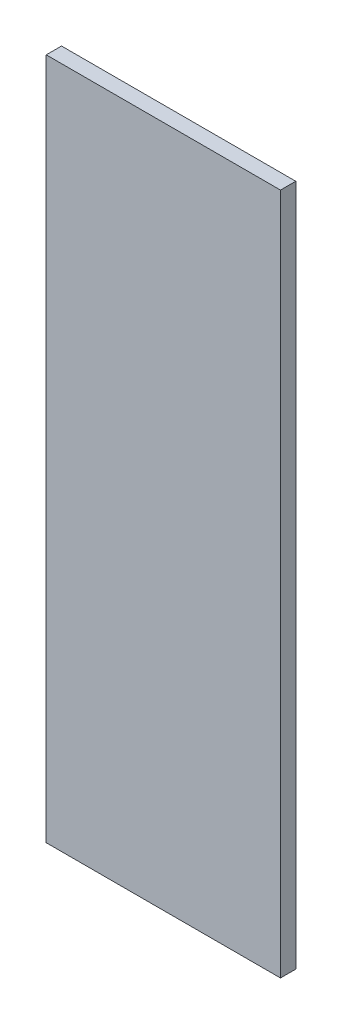
ISO-10303-21;
HEADER;
FILE_DESCRIPTION(('STEP AP214'),'2;1');
FILE_NAME('part.step','',(''),(''),'','','');
FILE_SCHEMA(('AUTOMOTIVE_DESIGN { 1 0 10303 214 1 1 1 1 }'));
ENDSEC;
DATA;
#1=APPLICATION_CONTEXT('core data for automotive mechanical design processes');
#2=APPLICATION_PROTOCOL_DEFINITION('international standard','automotive_design',2000,#1);
#3=PRODUCT_CONTEXT('',#1,'mechanical');
#4=PRODUCT('Part','Part','',(#3));
#5=PRODUCT_RELATED_PRODUCT_CATEGORY('part','',(#4));
#6=PRODUCT_DEFINITION_FORMATION('','',#4);
#7=PRODUCT_DEFINITION_CONTEXT('part definition',#1,'design');
#8=PRODUCT_DEFINITION('design','',#6,#7);
#9=PRODUCT_DEFINITION_SHAPE('','',#8);
#10=(LENGTH_UNIT() NAMED_UNIT(*) SI_UNIT(.MILLI.,.METRE.));
#11=(NAMED_UNIT(*) PLANE_ANGLE_UNIT() SI_UNIT($,.RADIAN.));
#12=(NAMED_UNIT(*) SI_UNIT($,.STERADIAN.) SOLID_ANGLE_UNIT());
#13=UNCERTAINTY_MEASURE_WITH_UNIT(LENGTH_MEASURE(1.E-05),#10,'distance_accuracy_value','');
#14=(GEOMETRIC_REPRESENTATION_CONTEXT(3) GLOBAL_UNCERTAINTY_ASSIGNED_CONTEXT((#13)) GLOBAL_UNIT_ASSIGNED_CONTEXT((#10,
#11,#12)) REPRESENTATION_CONTEXT('',''));
#15=CARTESIAN_POINT('',(0.,0.,0.));
#16=DIRECTION('',(0.,0.,1.));
#17=DIRECTION('',(1.,0.,0.));
#18=AXIS2_PLACEMENT_3D('',#15,#16,#17);
#19=CARTESIAN_POINT('',(11.5,-33.5,1.5));
#20=DIRECTION('',(-1.,0.,0.));
#21=DIRECTION('',(0.,0.,1.));
#22=AXIS2_PLACEMENT_3D('',#19,#20,#21);
#23=PLANE('',#22);
#24=DIRECTION('',(0.,1.,0.));
#25=VECTOR('',#24,1.);
#26=CARTESIAN_POINT('',(11.5,-33.5,0.));
#27=LINE('',#26,#25);
#28=CARTESIAN_POINT('',(11.5,-33.5,0.));
#29=VERTEX_POINT('',#28);
#30=CARTESIAN_POINT('',(11.5,33.5,0.));
#31=VERTEX_POINT('',#30);
#32=EDGE_CURVE('E98',#29,#31,#27,.T.);
#33=ORIENTED_EDGE('',*,*,#32,.T.);
#34=DIRECTION('',(0.,0.,-1.));
#35=VECTOR('',#34,1.);
#36=CARTESIAN_POINT('',(11.5,33.5,1.5));
#37=LINE('',#36,#35);
#38=CARTESIAN_POINT('',(11.5,33.5,1.5));
#39=VERTEX_POINT('',#38);
#40=EDGE_CURVE('E11',#39,#31,#37,.T.);
#41=ORIENTED_EDGE('',*,*,#40,.F.);
#42=DIRECTION('',(0.,1.,0.));
#43=VECTOR('',#42,1.);
#44=CARTESIAN_POINT('',(11.5,-33.5,1.5));
#45=LINE('',#44,#43);
#46=CARTESIAN_POINT('',(11.5,-33.5,1.5));
#47=VERTEX_POINT('',#46);
#48=EDGE_CURVE('E86',#47,#39,#45,.T.);
#49=ORIENTED_EDGE('',*,*,#48,.F.);
#50=DIRECTION('',(0.,0.,-1.));
#51=VECTOR('',#50,1.);
#52=CARTESIAN_POINT('',(11.5,-33.5,1.5));
#53=LINE('',#52,#51);
#54=EDGE_CURVE('E94',#47,#29,#53,.T.);
#55=ORIENTED_EDGE('',*,*,#54,.T.);
#56=EDGE_LOOP('',(#33,#41,#49,#55));
#57=FACE_BOUND('',#56,.T.);
#58=ADVANCED_FACE('F35',(#57),#23,.F.);
#59=CARTESIAN_POINT('',(-11.5,33.5,1.5));
#60=DIRECTION('',(0.,-1.,0.));
#61=DIRECTION('',(0.,0.,-1.));
#62=AXIS2_PLACEMENT_3D('',#59,#60,#61);
#63=PLANE('',#62);
#64=DIRECTION('',(-1.,0.,0.));
#65=VECTOR('',#64,1.);
#66=CARTESIAN_POINT('',(-11.5,33.5,0.));
#67=LINE('',#66,#65);
#68=CARTESIAN_POINT('',(-11.5,33.5,0.));
#69=VERTEX_POINT('',#68);
#70=EDGE_CURVE('E90',#31,#69,#67,.T.);
#71=ORIENTED_EDGE('',*,*,#70,.T.);
#72=DIRECTION('',(0.,0.,-1.));
#73=VECTOR('',#72,1.);
#74=CARTESIAN_POINT('',(-11.5,33.5,1.5));
#75=LINE('',#74,#73);
#76=CARTESIAN_POINT('',(-11.5,33.5,1.5));
#77=VERTEX_POINT('',#76);
#78=EDGE_CURVE('E43',#77,#69,#75,.T.);
#79=ORIENTED_EDGE('',*,*,#78,.F.);
#80=DIRECTION('',(-1.,0.,0.));
#81=VECTOR('',#80,1.);
#82=CARTESIAN_POINT('',(-11.5,33.5,1.5));
#83=LINE('',#82,#81);
#84=EDGE_CURVE('E81',#39,#77,#83,.T.);
#85=ORIENTED_EDGE('',*,*,#84,.F.);
#86=ORIENTED_EDGE('',*,*,#40,.T.);
#87=EDGE_LOOP('',(#71,#79,#85,#86));
#88=FACE_BOUND('',#87,.T.);
#89=ADVANCED_FACE('F89',(#88),#63,.F.);
#90=CARTESIAN_POINT('',(-11.5,-33.5,1.5));
#91=DIRECTION('',(1.,0.,0.));
#92=DIRECTION('',(0.,0.,-1.));
#93=AXIS2_PLACEMENT_3D('',#90,#91,#92);
#94=PLANE('',#93);
#95=DIRECTION('',(0.,-1.,0.));
#96=VECTOR('',#95,1.);
#97=CARTESIAN_POINT('',(-11.5,-33.5,0.));
#98=LINE('',#97,#96);
#99=CARTESIAN_POINT('',(-11.5,-33.5,0.));
#100=VERTEX_POINT('',#99);
#101=EDGE_CURVE('E68',#69,#100,#98,.T.);
#102=ORIENTED_EDGE('',*,*,#101,.T.);
#103=DIRECTION('',(0.,0.,-1.));
#104=VECTOR('',#103,1.);
#105=CARTESIAN_POINT('',(-11.5,-33.5,1.5));
#106=LINE('',#105,#104);
#107=CARTESIAN_POINT('',(-11.5,-33.5,1.5));
#108=VERTEX_POINT('',#107);
#109=EDGE_CURVE('E91',#108,#100,#106,.T.);
#110=ORIENTED_EDGE('',*,*,#109,.F.);
#111=DIRECTION('',(0.,-1.,0.));
#112=VECTOR('',#111,1.);
#113=CARTESIAN_POINT('',(-11.5,-33.5,1.5));
#114=LINE('',#113,#112);
#115=EDGE_CURVE('E84',#77,#108,#114,.T.);
#116=ORIENTED_EDGE('',*,*,#115,.F.);
#117=ORIENTED_EDGE('',*,*,#78,.T.);
#118=EDGE_LOOP('',(#102,#110,#116,#117));
#119=FACE_BOUND('',#118,.T.);
#120=ADVANCED_FACE('F92',(#119),#94,.F.);
#121=CARTESIAN_POINT('',(-11.5,-33.5,1.5));
#122=DIRECTION('',(0.,1.,0.));
#123=DIRECTION('',(0.,0.,1.));
#124=AXIS2_PLACEMENT_3D('',#121,#122,#123);
#125=PLANE('',#124);
#126=DIRECTION('',(1.,0.,0.));
#127=VECTOR('',#126,1.);
#128=CARTESIAN_POINT('',(-11.5,-33.5,0.));
#129=LINE('',#128,#127);
#130=EDGE_CURVE('E74',#100,#29,#129,.T.);
#131=ORIENTED_EDGE('',*,*,#130,.T.);
#132=ORIENTED_EDGE('',*,*,#54,.F.);
#133=DIRECTION('',(1.,0.,0.));
#134=VECTOR('',#133,1.);
#135=CARTESIAN_POINT('',(-11.5,-33.5,1.5));
#136=LINE('',#135,#134);
#137=EDGE_CURVE('E51',#108,#47,#136,.T.);
#138=ORIENTED_EDGE('',*,*,#137,.F.);
#139=ORIENTED_EDGE('',*,*,#109,.T.);
#140=EDGE_LOOP('',(#131,#132,#138,#139));
#141=FACE_BOUND('',#140,.T.);
#142=ADVANCED_FACE('F105',(#141),#125,.F.);
#143=CARTESIAN_POINT('',(0.,0.,1.5));
#144=DIRECTION('',(0.,0.,-1.));
#145=DIRECTION('',(-1.,0.,0.));
#146=AXIS2_PLACEMENT_3D('',#143,#144,#145);
#147=PLANE('',#146);
#148=ORIENTED_EDGE('',*,*,#48,.T.);
#149=ORIENTED_EDGE('',*,*,#84,.T.);
#150=ORIENTED_EDGE('',*,*,#115,.T.);
#151=ORIENTED_EDGE('',*,*,#137,.T.);
#152=EDGE_LOOP('',(#148,#149,#150,#151));
#153=FACE_BOUND('',#152,.T.);
#154=ADVANCED_FACE('F82',(#153),#147,.F.);
#155=CARTESIAN_POINT('',(0.,0.,0.));
#156=DIRECTION('',(0.,0.,-1.));
#157=DIRECTION('',(-1.,0.,0.));
#158=AXIS2_PLACEMENT_3D('',#155,#156,#157);
#159=PLANE('',#158);
#160=ORIENTED_EDGE('',*,*,#32,.F.);
#161=ORIENTED_EDGE('',*,*,#130,.F.);
#162=ORIENTED_EDGE('',*,*,#101,.F.);
#163=ORIENTED_EDGE('',*,*,#70,.F.);
#164=EDGE_LOOP('',(#160,#161,#162,#163));
#165=FACE_BOUND('',#164,.T.);
#166=ADVANCED_FACE('F108',(#165),#159,.T.);
#167=CLOSED_SHELL('',(#58,#89,#120,#142,#154,#166));
#168=MANIFOLD_SOLID_BREP('B2',#167);
#169=ADVANCED_BREP_SHAPE_REPRESENTATION('',(#18,#168),#14);
#170=SHAPE_DEFINITION_REPRESENTATION(#9,#169);
ENDSEC;
END-ISO-10303-21;
